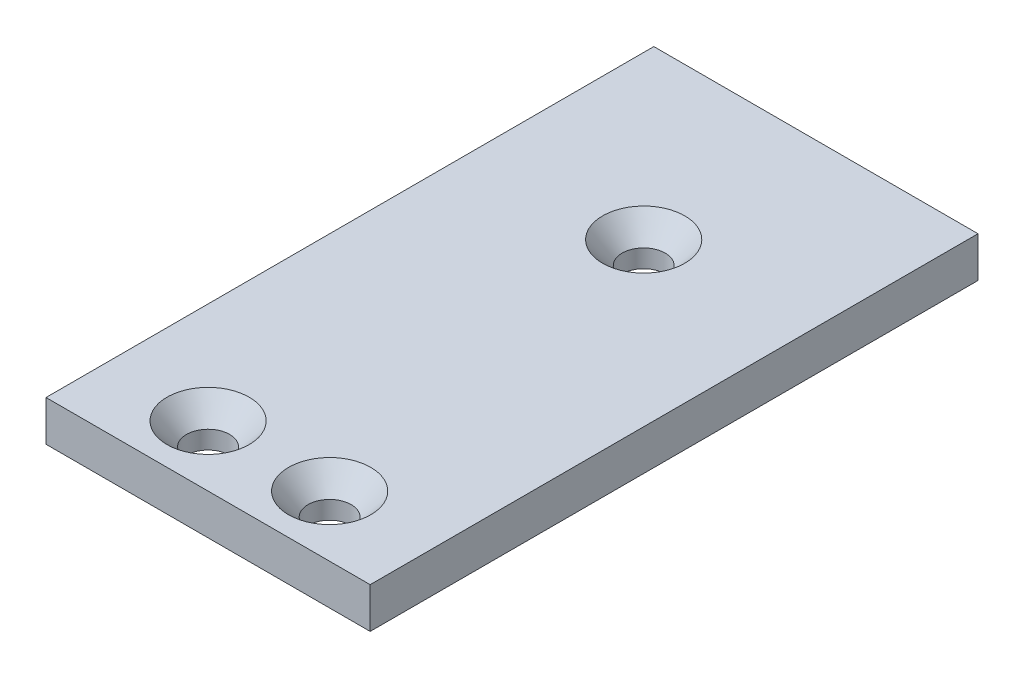
ISO-10303-21;
HEADER;
FILE_DESCRIPTION(('STEP AP214'),'2;1');
FILE_NAME('part.step','',(''),(''),'','','');
FILE_SCHEMA(('AUTOMOTIVE_DESIGN { 1 0 10303 214 1 1 1 1 }'));
ENDSEC;
DATA;
#1=APPLICATION_CONTEXT('core data for automotive mechanical design processes');
#2=APPLICATION_PROTOCOL_DEFINITION('international standard','automotive_design',2000,#1);
#3=PRODUCT_CONTEXT('',#1,'mechanical');
#4=PRODUCT('Part','Part','',(#3));
#5=PRODUCT_RELATED_PRODUCT_CATEGORY('part','',(#4));
#6=PRODUCT_DEFINITION_FORMATION('','',#4);
#7=PRODUCT_DEFINITION_CONTEXT('part definition',#1,'design');
#8=PRODUCT_DEFINITION('design','',#6,#7);
#9=PRODUCT_DEFINITION_SHAPE('','',#8);
#10=(LENGTH_UNIT() NAMED_UNIT(*) SI_UNIT(.MILLI.,.METRE.));
#11=(NAMED_UNIT(*) PLANE_ANGLE_UNIT() SI_UNIT($,.RADIAN.));
#12=(NAMED_UNIT(*) SI_UNIT($,.STERADIAN.) SOLID_ANGLE_UNIT());
#13=UNCERTAINTY_MEASURE_WITH_UNIT(LENGTH_MEASURE(1.E-05),#10,'distance_accuracy_value','');
#14=(GEOMETRIC_REPRESENTATION_CONTEXT(3) GLOBAL_UNCERTAINTY_ASSIGNED_CONTEXT((#13)) GLOBAL_UNIT_ASSIGNED_CONTEXT((#10,
#11,#12)) REPRESENTATION_CONTEXT('',''));
#15=CARTESIAN_POINT('',(0.,0.,0.));
#16=DIRECTION('',(0.,0.,1.));
#17=DIRECTION('',(1.,0.,0.));
#18=AXIS2_PLACEMENT_3D('',#15,#16,#17);
#19=CARTESIAN_POINT('',(0.,6.35,0.));
#20=DIRECTION('',(1.,0.,0.));
#21=DIRECTION('',(0.,0.,-1.));
#22=AXIS2_PLACEMENT_3D('',#19,#20,#21);
#23=PLANE('',#22);
#24=DIRECTION('',(0.,0.,1.));
#25=VECTOR('',#24,1.);
#26=CARTESIAN_POINT('',(0.,0.,0.));
#27=LINE('',#26,#25);
#28=CARTESIAN_POINT('',(0.,0.,-95.25));
#29=VERTEX_POINT('',#28);
#30=CARTESIAN_POINT('',(0.,0.,0.));
#31=VERTEX_POINT('',#30);
#32=EDGE_CURVE('E96',#29,#31,#27,.T.);
#33=ORIENTED_EDGE('',*,*,#32,.T.);
#34=DIRECTION('',(0.,-1.,0.));
#35=VECTOR('',#34,1.);
#36=CARTESIAN_POINT('',(0.,6.35,0.));
#37=LINE('',#36,#35);
#38=CARTESIAN_POINT('',(0.,6.35,0.));
#39=VERTEX_POINT('',#38);
#40=EDGE_CURVE('E11',#39,#31,#37,.T.);
#41=ORIENTED_EDGE('',*,*,#40,.F.);
#42=DIRECTION('',(0.,0.,1.));
#43=VECTOR('',#42,1.);
#44=CARTESIAN_POINT('',(0.,6.35,0.));
#45=LINE('',#44,#43);
#46=CARTESIAN_POINT('',(0.,6.35,-95.25));
#47=VERTEX_POINT('',#46);
#48=EDGE_CURVE('E84',#47,#39,#45,.T.);
#49=ORIENTED_EDGE('',*,*,#48,.F.);
#50=DIRECTION('',(0.,-1.,0.));
#51=VECTOR('',#50,1.);
#52=CARTESIAN_POINT('',(0.,6.35,-95.25));
#53=LINE('',#52,#51);
#54=EDGE_CURVE('E92',#47,#29,#53,.T.);
#55=ORIENTED_EDGE('',*,*,#54,.T.);
#56=EDGE_LOOP('',(#33,#41,#49,#55));
#57=FACE_BOUND('',#56,.T.);
#58=ADVANCED_FACE('F33',(#57),#23,.F.);
#59=CARTESIAN_POINT('',(0.,6.35,0.));
#60=DIRECTION('',(0.,0.,-1.));
#61=DIRECTION('',(-1.,0.,0.));
#62=AXIS2_PLACEMENT_3D('',#59,#60,#61);
#63=PLANE('',#62);
#64=DIRECTION('',(1.,0.,0.));
#65=VECTOR('',#64,1.);
#66=CARTESIAN_POINT('',(0.,0.,0.));
#67=LINE('',#66,#65);
#68=CARTESIAN_POINT('',(50.8,0.,0.));
#69=VERTEX_POINT('',#68);
#70=EDGE_CURVE('E88',#31,#69,#67,.T.);
#71=ORIENTED_EDGE('',*,*,#70,.T.);
#72=DIRECTION('',(0.,-1.,0.));
#73=VECTOR('',#72,1.);
#74=CARTESIAN_POINT('',(50.8,6.35,0.));
#75=LINE('',#74,#73);
#76=CARTESIAN_POINT('',(50.8,6.35,0.));
#77=VERTEX_POINT('',#76);
#78=EDGE_CURVE('E41',#77,#69,#75,.T.);
#79=ORIENTED_EDGE('',*,*,#78,.F.);
#80=DIRECTION('',(1.,0.,0.));
#81=VECTOR('',#80,1.);
#82=CARTESIAN_POINT('',(0.,6.35,0.));
#83=LINE('',#82,#81);
#84=EDGE_CURVE('E79',#39,#77,#83,.T.);
#85=ORIENTED_EDGE('',*,*,#84,.F.);
#86=ORIENTED_EDGE('',*,*,#40,.T.);
#87=EDGE_LOOP('',(#71,#79,#85,#86));
#88=FACE_BOUND('',#87,.T.);
#89=ADVANCED_FACE('F87',(#88),#63,.F.);
#90=CARTESIAN_POINT('',(50.8,6.35,0.));
#91=DIRECTION('',(-1.,0.,0.));
#92=DIRECTION('',(0.,0.,1.));
#93=AXIS2_PLACEMENT_3D('',#90,#91,#92);
#94=PLANE('',#93);
#95=DIRECTION('',(0.,0.,-1.));
#96=VECTOR('',#95,1.);
#97=CARTESIAN_POINT('',(50.8,0.,0.));
#98=LINE('',#97,#96);
#99=CARTESIAN_POINT('',(50.8,0.,-95.25));
#100=VERTEX_POINT('',#99);
#101=EDGE_CURVE('E66',#69,#100,#98,.T.);
#102=ORIENTED_EDGE('',*,*,#101,.T.);
#103=DIRECTION('',(0.,-1.,0.));
#104=VECTOR('',#103,1.);
#105=CARTESIAN_POINT('',(50.8,6.35,-95.25));
#106=LINE('',#105,#104);
#107=CARTESIAN_POINT('',(50.8,6.35,-95.25));
#108=VERTEX_POINT('',#107);
#109=EDGE_CURVE('E89',#108,#100,#106,.T.);
#110=ORIENTED_EDGE('',*,*,#109,.F.);
#111=DIRECTION('',(0.,0.,-1.));
#112=VECTOR('',#111,1.);
#113=CARTESIAN_POINT('',(50.8,6.35,0.));
#114=LINE('',#113,#112);
#115=EDGE_CURVE('E82',#77,#108,#114,.T.);
#116=ORIENTED_EDGE('',*,*,#115,.F.);
#117=ORIENTED_EDGE('',*,*,#78,.T.);
#118=EDGE_LOOP('',(#102,#110,#116,#117));
#119=FACE_BOUND('',#118,.T.);
#120=ADVANCED_FACE('F90',(#119),#94,.F.);
#121=CARTESIAN_POINT('',(0.,6.35,-95.25));
#122=DIRECTION('',(0.,0.,1.));
#123=DIRECTION('',(1.,0.,0.));
#124=AXIS2_PLACEMENT_3D('',#121,#122,#123);
#125=PLANE('',#124);
#126=DIRECTION('',(-1.,0.,0.));
#127=VECTOR('',#126,1.);
#128=CARTESIAN_POINT('',(0.,0.,-95.25));
#129=LINE('',#128,#127);
#130=EDGE_CURVE('E72',#100,#29,#129,.T.);
#131=ORIENTED_EDGE('',*,*,#130,.T.);
#132=ORIENTED_EDGE('',*,*,#54,.F.);
#133=DIRECTION('',(-1.,0.,0.));
#134=VECTOR('',#133,1.);
#135=CARTESIAN_POINT('',(0.,6.35,-95.25));
#136=LINE('',#135,#134);
#137=EDGE_CURVE('E49',#108,#47,#136,.T.);
#138=ORIENTED_EDGE('',*,*,#137,.F.);
#139=ORIENTED_EDGE('',*,*,#109,.T.);
#140=EDGE_LOOP('',(#131,#132,#138,#139));
#141=FACE_BOUND('',#140,.T.);
#142=ADVANCED_FACE('F104',(#141),#125,.F.);
#143=CARTESIAN_POINT('',(0.,6.35,0.));
#144=DIRECTION('',(0.,-1.,0.));
#145=DIRECTION('',(0.,0.,-1.));
#146=AXIS2_PLACEMENT_3D('',#143,#144,#145);
#147=PLANE('',#146);
#148=CARTESIAN_POINT('',(25.4,6.35,-68.2625));
#149=DIRECTION('',(0.,1.,0.));
#150=DIRECTION('',(0.,0.,1.));
#151=AXIS2_PLACEMENT_3D('',#148,#149,#150);
#152=CIRCLE('',#151,6.4389);
#153=CARTESIAN_POINT('',(25.4,6.35,-61.8236));
#154=VERTEX_POINT('',#153);
#155=EDGE_CURVE('E133',#154,#154,#152,.T.);
#156=ORIENTED_EDGE('',*,*,#155,.F.);
#157=EDGE_LOOP('',(#156));
#158=FACE_BOUND('',#157,.T.);
#159=CARTESIAN_POINT('',(15.875,6.35,-9.525));
#160=DIRECTION('',(0.,1.,0.));
#161=DIRECTION('',(0.,0.,1.));
#162=AXIS2_PLACEMENT_3D('',#159,#160,#161);
#163=CIRCLE('',#162,6.4389);
#164=CARTESIAN_POINT('',(15.875,6.35,-3.0861));
#165=VERTEX_POINT('',#164);
#166=EDGE_CURVE('E124',#165,#165,#163,.T.);
#167=ORIENTED_EDGE('',*,*,#166,.F.);
#168=EDGE_LOOP('',(#167));
#169=FACE_BOUND('',#168,.T.);
#170=CARTESIAN_POINT('',(34.925,6.35,-9.525));
#171=DIRECTION('',(0.,1.,0.));
#172=DIRECTION('',(0.,0.,1.));
#173=AXIS2_PLACEMENT_3D('',#170,#171,#172);
#174=CIRCLE('',#173,6.4389);
#175=CARTESIAN_POINT('',(34.925,6.35,-3.0861));
#176=VERTEX_POINT('',#175);
#177=EDGE_CURVE('E115',#176,#176,#174,.T.);
#178=ORIENTED_EDGE('',*,*,#177,.F.);
#179=EDGE_LOOP('',(#178));
#180=FACE_BOUND('',#179,.T.);
#181=ORIENTED_EDGE('',*,*,#48,.T.);
#182=ORIENTED_EDGE('',*,*,#84,.T.);
#183=ORIENTED_EDGE('',*,*,#115,.T.);
#184=ORIENTED_EDGE('',*,*,#137,.T.);
#185=EDGE_LOOP('',(#181,#182,#183,#184));
#186=FACE_BOUND('',#185,.T.);
#187=ADVANCED_FACE('F80',(#158,#169,#180,#186),#147,.F.);
#188=CARTESIAN_POINT('',(0.,0.,0.));
#189=DIRECTION('',(0.,-1.,0.));
#190=DIRECTION('',(0.,0.,-1.));
#191=AXIS2_PLACEMENT_3D('',#188,#189,#190);
#192=PLANE('',#191);
#193=CARTESIAN_POINT('',(25.4,0.,-68.2625));
#194=DIRECTION('',(0.,1.,0.));
#195=DIRECTION('',(0.,0.,1.));
#196=AXIS2_PLACEMENT_3D('',#193,#194,#195);
#197=CIRCLE('',#196,3.3782);
#198=CARTESIAN_POINT('',(25.4,0.,-64.8843));
#199=VERTEX_POINT('',#198);
#200=EDGE_CURVE('E127',#199,#199,#197,.T.);
#201=ORIENTED_EDGE('',*,*,#200,.T.);
#202=EDGE_LOOP('',(#201));
#203=FACE_BOUND('',#202,.T.);
#204=CARTESIAN_POINT('',(15.875,0.,-9.525));
#205=DIRECTION('',(0.,1.,0.));
#206=DIRECTION('',(0.,0.,1.));
#207=AXIS2_PLACEMENT_3D('',#204,#205,#206);
#208=CIRCLE('',#207,3.3782);
#209=CARTESIAN_POINT('',(15.875,0.,-6.1468));
#210=VERTEX_POINT('',#209);
#211=EDGE_CURVE('E118',#210,#210,#208,.T.);
#212=ORIENTED_EDGE('',*,*,#211,.T.);
#213=EDGE_LOOP('',(#212));
#214=FACE_BOUND('',#213,.T.);
#215=CARTESIAN_POINT('',(34.925,0.,-9.525));
#216=DIRECTION('',(0.,1.,0.));
#217=DIRECTION('',(0.,0.,1.));
#218=AXIS2_PLACEMENT_3D('',#215,#216,#217);
#219=CIRCLE('',#218,3.3782);
#220=CARTESIAN_POINT('',(34.925,0.,-6.1468));
#221=VERTEX_POINT('',#220);
#222=EDGE_CURVE('E99',#221,#221,#219,.T.);
#223=ORIENTED_EDGE('',*,*,#222,.T.);
#224=EDGE_LOOP('',(#223));
#225=FACE_BOUND('',#224,.T.);
#226=ORIENTED_EDGE('',*,*,#32,.F.);
#227=ORIENTED_EDGE('',*,*,#130,.F.);
#228=ORIENTED_EDGE('',*,*,#101,.F.);
#229=ORIENTED_EDGE('',*,*,#70,.F.);
#230=EDGE_LOOP('',(#226,#227,#228,#229));
#231=FACE_BOUND('',#230,.T.);
#232=ADVANCED_FACE('F107',(#203,#214,#225,#231),#192,.T.);
#233=CARTESIAN_POINT('',(34.925,6.35,-9.525));
#234=DIRECTION('',(0.,1.,0.));
#235=DIRECTION('',(0.,0.,1.));
#236=AXIS2_PLACEMENT_3D('',#233,#234,#235);
#237=CYLINDRICAL_SURFACE('',#236,3.3782);
#238=ORIENTED_EDGE('',*,*,#222,.F.);
#239=EDGE_LOOP('',(#238));
#240=FACE_BOUND('',#239,.T.);
#241=CARTESIAN_POINT('',(34.925,2.82906741601865,-9.525));
#242=DIRECTION('',(0.,1.,0.));
#243=DIRECTION('',(0.,0.,1.));
#244=AXIS2_PLACEMENT_3D('',#241,#242,#243);
#245=CIRCLE('',#244,3.3782);
#246=CARTESIAN_POINT('',(34.925,2.82906741601865,-6.1468));
#247=VERTEX_POINT('',#246);
#248=EDGE_CURVE('E112',#247,#247,#245,.T.);
#249=ORIENTED_EDGE('',*,*,#248,.T.);
#250=EDGE_LOOP('',(#249));
#251=FACE_BOUND('',#250,.T.);
#252=ADVANCED_FACE('F149',(#240,#251),#237,.F.);
#253=CARTESIAN_POINT('',(34.925,6.35,-9.525));
#254=DIRECTION('',(0.,1.,0.));
#255=DIRECTION('',(0.,0.,1.));
#256=AXIS2_PLACEMENT_3D('',#253,#254,#255);
#257=CONICAL_SURFACE('',#256,6.4389,0.715584993317675);
#258=ORIENTED_EDGE('',*,*,#248,.F.);
#259=EDGE_LOOP('',(#258));
#260=FACE_BOUND('',#259,.T.);
#261=ORIENTED_EDGE('',*,*,#177,.T.);
#262=EDGE_LOOP('',(#261));
#263=FACE_BOUND('',#262,.T.);
#264=ADVANCED_FACE('F146',(#260,#263),#257,.F.);
#265=CARTESIAN_POINT('',(15.875,6.35,-9.525));
#266=DIRECTION('',(0.,1.,0.));
#267=DIRECTION('',(0.,0.,1.));
#268=AXIS2_PLACEMENT_3D('',#265,#266,#267);
#269=CYLINDRICAL_SURFACE('',#268,3.3782);
#270=ORIENTED_EDGE('',*,*,#211,.F.);
#271=EDGE_LOOP('',(#270));
#272=FACE_BOUND('',#271,.T.);
#273=CARTESIAN_POINT('',(15.875,2.82906741601865,-9.525));
#274=DIRECTION('',(0.,1.,0.));
#275=DIRECTION('',(0.,0.,1.));
#276=AXIS2_PLACEMENT_3D('',#273,#274,#275);
#277=CIRCLE('',#276,3.3782);
#278=CARTESIAN_POINT('',(15.875,2.82906741601865,-6.1468));
#279=VERTEX_POINT('',#278);
#280=EDGE_CURVE('E121',#279,#279,#277,.T.);
#281=ORIENTED_EDGE('',*,*,#280,.T.);
#282=EDGE_LOOP('',(#281));
#283=FACE_BOUND('',#282,.T.);
#284=ADVANCED_FACE('F148',(#272,#283),#269,.F.);
#285=CARTESIAN_POINT('',(15.875,6.35,-9.525));
#286=DIRECTION('',(0.,1.,0.));
#287=DIRECTION('',(0.,0.,1.));
#288=AXIS2_PLACEMENT_3D('',#285,#286,#287);
#289=CONICAL_SURFACE('',#288,6.4389,0.715584993317675);
#290=ORIENTED_EDGE('',*,*,#280,.F.);
#291=EDGE_LOOP('',(#290));
#292=FACE_BOUND('',#291,.T.);
#293=ORIENTED_EDGE('',*,*,#166,.T.);
#294=EDGE_LOOP('',(#293));
#295=FACE_BOUND('',#294,.T.);
#296=ADVANCED_FACE('F156',(#292,#295),#289,.F.);
#297=CARTESIAN_POINT('',(25.4,6.35,-68.2625));
#298=DIRECTION('',(0.,1.,0.));
#299=DIRECTION('',(0.,0.,1.));
#300=AXIS2_PLACEMENT_3D('',#297,#298,#299);
#301=CYLINDRICAL_SURFACE('',#300,3.3782);
#302=ORIENTED_EDGE('',*,*,#200,.F.);
#303=EDGE_LOOP('',(#302));
#304=FACE_BOUND('',#303,.T.);
#305=CARTESIAN_POINT('',(25.4,2.82906741601865,-68.2625));
#306=DIRECTION('',(0.,1.,0.));
#307=DIRECTION('',(0.,0.,1.));
#308=AXIS2_PLACEMENT_3D('',#305,#306,#307);
#309=CIRCLE('',#308,3.3782);
#310=CARTESIAN_POINT('',(25.4,2.82906741601865,-64.8843));
#311=VERTEX_POINT('',#310);
#312=EDGE_CURVE('E130',#311,#311,#309,.T.);
#313=ORIENTED_EDGE('',*,*,#312,.T.);
#314=EDGE_LOOP('',(#313));
#315=FACE_BOUND('',#314,.T.);
#316=ADVANCED_FACE('F188',(#304,#315),#301,.F.);
#317=CARTESIAN_POINT('',(25.4,6.35,-68.2625));
#318=DIRECTION('',(0.,1.,0.));
#319=DIRECTION('',(0.,0.,1.));
#320=AXIS2_PLACEMENT_3D('',#317,#318,#319);
#321=CONICAL_SURFACE('',#320,6.4389,0.715584993317676);
#322=ORIENTED_EDGE('',*,*,#312,.F.);
#323=EDGE_LOOP('',(#322));
#324=FACE_BOUND('',#323,.T.);
#325=ORIENTED_EDGE('',*,*,#155,.T.);
#326=EDGE_LOOP('',(#325));
#327=FACE_BOUND('',#326,.T.);
#328=ADVANCED_FACE('F137',(#324,#327),#321,.F.);
#329=CLOSED_SHELL('',(#58,#89,#120,#142,#187,#232,#252,#264,#284,#296,#316,#328));
#330=MANIFOLD_SOLID_BREP('B2',#329);
#331=ADVANCED_BREP_SHAPE_REPRESENTATION('',(#18,#330),#14);
#332=SHAPE_DEFINITION_REPRESENTATION(#9,#331);
ENDSEC;
END-ISO-10303-21;
